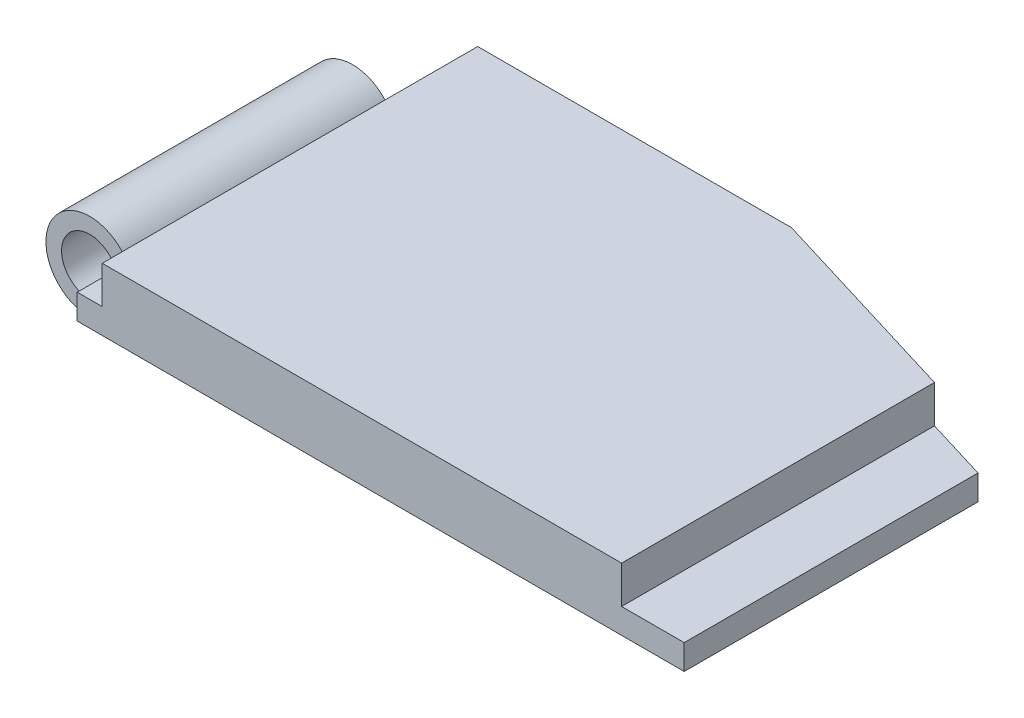
ISO-10303-21;
HEADER;
FILE_DESCRIPTION(('STEP AP214'),'2;1');
FILE_NAME('part.step','',(''),(''),'','','');
FILE_SCHEMA(('AUTOMOTIVE_DESIGN { 1 0 10303 214 1 1 1 1 }'));
ENDSEC;
DATA;
#1=APPLICATION_CONTEXT('core data for automotive mechanical design processes');
#2=APPLICATION_PROTOCOL_DEFINITION('international standard','automotive_design',2000,#1);
#3=PRODUCT_CONTEXT('',#1,'mechanical');
#4=PRODUCT('Part','Part','',(#3));
#5=PRODUCT_RELATED_PRODUCT_CATEGORY('part','',(#4));
#6=PRODUCT_DEFINITION_FORMATION('','',#4);
#7=PRODUCT_DEFINITION_CONTEXT('part definition',#1,'design');
#8=PRODUCT_DEFINITION('design','',#6,#7);
#9=PRODUCT_DEFINITION_SHAPE('','',#8);
#10=(LENGTH_UNIT() NAMED_UNIT(*) SI_UNIT(.MILLI.,.METRE.));
#11=(NAMED_UNIT(*) PLANE_ANGLE_UNIT() SI_UNIT($,.RADIAN.));
#12=(NAMED_UNIT(*) SI_UNIT($,.STERADIAN.) SOLID_ANGLE_UNIT());
#13=UNCERTAINTY_MEASURE_WITH_UNIT(LENGTH_MEASURE(1.E-05),#10,'distance_accuracy_value','');
#14=(GEOMETRIC_REPRESENTATION_CONTEXT(3) GLOBAL_UNCERTAINTY_ASSIGNED_CONTEXT((#13)) GLOBAL_UNIT_ASSIGNED_CONTEXT((#10,
#11,#12)) REPRESENTATION_CONTEXT('',''));
#15=CARTESIAN_POINT('',(0.,0.,0.));
#16=DIRECTION('',(0.,0.,1.));
#17=DIRECTION('',(1.,0.,0.));
#18=AXIS2_PLACEMENT_3D('',#15,#16,#17);
#19=CARTESIAN_POINT('',(0.,-0.25,4.5));
#20=DIRECTION('',(0.,0.,1.));
#21=DIRECTION('',(1.,0.,0.));
#22=AXIS2_PLACEMENT_3D('',#19,#20,#21);
#23=CYLINDRICAL_SURFACE('',#22,3.5);
#24=CARTESIAN_POINT('',(0.,-0.25,4.5));
#25=DIRECTION('',(0.,0.,1.));
#26=DIRECTION('',(1.,0.,0.));
#27=AXIS2_PLACEMENT_3D('',#24,#25,#26);
#28=CIRCLE('',#27,3.5);
#29=CARTESIAN_POINT('',(3.50000000000001,-0.25,4.5));
#30=VERTEX_POINT('',#29);
#31=EDGE_CURVE('E12',#30,#30,#28,.T.);
#32=CARTESIAN_POINT('',(0.,-0.25,25.5));
#33=DIRECTION('',(0.,0.,1.));
#34=DIRECTION('',(1.,0.,0.));
#35=AXIS2_PLACEMENT_3D('',#32,#33,#34);
#36=CIRCLE('',#35,3.5);
#37=CARTESIAN_POINT('',(3.50000000000001,-0.25,25.5));
#38=VERTEX_POINT('',#37);
#39=EDGE_CURVE('E56',#38,#38,#36,.T.);
#40=CARTESIAN_POINT('',(3.50000000000001,-0.25,4.5));
#41=CARTESIAN_POINT('',(3.50000000000001,-0.25,4.71875));
#42=CARTESIAN_POINT('',(3.50000000000001,-0.25,4.9375));
#43=CARTESIAN_POINT('',(3.50000000000001,-0.25,5.375));
#44=CARTESIAN_POINT('',(3.50000000000001,-0.25,5.59375));
#45=CARTESIAN_POINT('',(3.50000000000001,-0.25,6.03125));
#46=CARTESIAN_POINT('',(3.50000000000001,-0.25,6.25));
#47=CARTESIAN_POINT('',(3.50000000000001,-0.25,6.6875));
#48=CARTESIAN_POINT('',(3.50000000000001,-0.25,6.90625));
#49=CARTESIAN_POINT('',(3.50000000000001,-0.25,7.34375));
#50=CARTESIAN_POINT('',(3.50000000000001,-0.25,7.5625));
#51=CARTESIAN_POINT('',(3.50000000000001,-0.25,8.));
#52=CARTESIAN_POINT('',(3.50000000000001,-0.25,8.21875));
#53=CARTESIAN_POINT('',(3.50000000000001,-0.25,8.65625));
#54=CARTESIAN_POINT('',(3.50000000000001,-0.25,8.875));
#55=CARTESIAN_POINT('',(3.50000000000001,-0.25,9.3125));
#56=CARTESIAN_POINT('',(3.50000000000001,-0.25,9.53125));
#57=CARTESIAN_POINT('',(3.50000000000001,-0.25,9.96875));
#58=CARTESIAN_POINT('',(3.50000000000001,-0.25,10.1875));
#59=CARTESIAN_POINT('',(3.50000000000001,-0.25,10.625));
#60=CARTESIAN_POINT('',(3.50000000000001,-0.25,10.84375));
#61=CARTESIAN_POINT('',(3.50000000000001,-0.25,11.28125));
#62=CARTESIAN_POINT('',(3.50000000000001,-0.25,11.5));
#63=CARTESIAN_POINT('',(3.50000000000001,-0.25,11.9375));
#64=CARTESIAN_POINT('',(3.50000000000001,-0.25,12.15625));
#65=CARTESIAN_POINT('',(3.50000000000001,-0.25,12.59375));
#66=CARTESIAN_POINT('',(3.50000000000001,-0.25,12.8125));
#67=CARTESIAN_POINT('',(3.50000000000001,-0.25,13.25));
#68=CARTESIAN_POINT('',(3.50000000000001,-0.25,13.46875));
#69=CARTESIAN_POINT('',(3.50000000000001,-0.25,13.90625));
#70=CARTESIAN_POINT('',(3.50000000000001,-0.25,14.125));
#71=CARTESIAN_POINT('',(3.50000000000001,-0.25,14.5625));
#72=CARTESIAN_POINT('',(3.50000000000001,-0.25,14.78125));
#73=CARTESIAN_POINT('',(3.50000000000001,-0.25,15.21875));
#74=CARTESIAN_POINT('',(3.50000000000001,-0.25,15.4375));
#75=CARTESIAN_POINT('',(3.50000000000001,-0.25,15.875));
#76=CARTESIAN_POINT('',(3.50000000000001,-0.25,16.09375));
#77=CARTESIAN_POINT('',(3.50000000000001,-0.25,16.53125));
#78=CARTESIAN_POINT('',(3.50000000000001,-0.25,16.75));
#79=CARTESIAN_POINT('',(3.50000000000001,-0.25,17.1875));
#80=CARTESIAN_POINT('',(3.50000000000001,-0.25,17.40625));
#81=CARTESIAN_POINT('',(3.50000000000001,-0.25,17.84375));
#82=CARTESIAN_POINT('',(3.50000000000001,-0.25,18.0625));
#83=CARTESIAN_POINT('',(3.50000000000001,-0.25,18.5));
#84=CARTESIAN_POINT('',(3.50000000000001,-0.25,18.71875));
#85=CARTESIAN_POINT('',(3.50000000000001,-0.25,19.15625));
#86=CARTESIAN_POINT('',(3.50000000000001,-0.25,19.375));
#87=CARTESIAN_POINT('',(3.50000000000001,-0.25,19.8125));
#88=CARTESIAN_POINT('',(3.50000000000001,-0.25,20.03125));
#89=CARTESIAN_POINT('',(3.50000000000001,-0.25,20.46875));
#90=CARTESIAN_POINT('',(3.50000000000001,-0.25,20.6875));
#91=CARTESIAN_POINT('',(3.50000000000001,-0.25,21.125));
#92=CARTESIAN_POINT('',(3.50000000000001,-0.25,21.34375));
#93=CARTESIAN_POINT('',(3.50000000000001,-0.25,21.78125));
#94=CARTESIAN_POINT('',(3.50000000000001,-0.25,22.));
#95=CARTESIAN_POINT('',(3.50000000000001,-0.25,22.4375));
#96=CARTESIAN_POINT('',(3.50000000000001,-0.25,22.65625));
#97=CARTESIAN_POINT('',(3.50000000000001,-0.25,23.09375));
#98=CARTESIAN_POINT('',(3.50000000000001,-0.25,23.3125));
#99=CARTESIAN_POINT('',(3.50000000000001,-0.25,23.75));
#100=CARTESIAN_POINT('',(3.50000000000001,-0.25,23.96875));
#101=CARTESIAN_POINT('',(3.50000000000001,-0.25,24.40625));
#102=CARTESIAN_POINT('',(3.50000000000001,-0.25,24.625));
#103=CARTESIAN_POINT('',(3.50000000000001,-0.25,25.0625));
#104=CARTESIAN_POINT('',(3.50000000000001,-0.25,25.28125));
#105=CARTESIAN_POINT('',(3.50000000000001,-0.25,25.5));
#106=B_SPLINE_CURVE_WITH_KNOTS('',3,(#40,#41,#42,#43,#44,#45,#46,#47,#48,#49,#50,#51,#52,#53,
#54,#55,#56,#57,#58,#59,#60,#61,#62,#63,#64,#65,#66,#67,#68,#69,#70,#71,#72,#73,#74,#75,#76,#77,
#78,#79,#80,#81,#82,#83,#84,#85,#86,#87,#88,#89,#90,#91,#92,#93,#94,#95,#96,#97,#98,#99,#100,
#101,#102,#103,#104,#105),.UNSPECIFIED.,.F.,.F.,(4,2,2,2,2,2,2,2,2,2,2,2,2,2,2,2,2,2,2,2,2,2,2,
2,2,2,2,2,2,2,2,2,4),(0.,0.65625,1.3125,1.96875,2.625,3.28125,3.9375,4.59375,5.25,5.90625,
6.5625,7.21875,7.875,8.53125,9.1875,9.84375,10.5,11.15625,11.8125,12.46875,13.125,13.78125,
14.4375,15.09375,15.75,16.40625,17.0625,17.71875,18.375,19.03125,19.6875,20.34375,21.),.UNSPECIFIED.);
#107=EDGE_CURVE('BSEAM47',#30,#38,#106,.T.);
#108=ORIENTED_EDGE('',*,*,#31,.T.);
#109=ORIENTED_EDGE('',*,*,#39,.F.);
#110=ORIENTED_EDGE('',*,*,#107,.T.);
#111=ORIENTED_EDGE('',*,*,#107,.F.);
#112=EDGE_LOOP('',(#108,#110,#109,#111));
#113=FACE_BOUND('',#112,.T.);
#114=ADVANCED_FACE('F47',(#113),#23,.T.);
#115=CARTESIAN_POINT('',(0.,-0.25,4.5));
#116=DIRECTION('',(0.,0.,1.));
#117=DIRECTION('',(1.,0.,0.));
#118=AXIS2_PLACEMENT_3D('',#115,#116,#117);
#119=PLANE('',#118);
#120=ORIENTED_EDGE('',*,*,#31,.F.);
#121=EDGE_LOOP('',(#120));
#122=FACE_BOUND('',#121,.T.);
#123=CARTESIAN_POINT('',(0.,-0.25,4.5));
#124=DIRECTION('',(0.,0.,1.));
#125=DIRECTION('',(1.,0.,0.));
#126=AXIS2_PLACEMENT_3D('',#123,#124,#125);
#127=CIRCLE('',#126,2.25);
#128=CARTESIAN_POINT('',(2.25,-0.25,4.5));
#129=VERTEX_POINT('',#128);
#130=EDGE_CURVE('E54',#129,#129,#127,.T.);
#131=ORIENTED_EDGE('',*,*,#130,.T.);
#132=EDGE_LOOP('',(#131));
#133=FACE_BOUND('',#132,.T.);
#134=ADVANCED_FACE('F76',(#122,#133),#119,.F.);
#135=CARTESIAN_POINT('',(0.,-0.25,4.5));
#136=DIRECTION('',(0.,0.,1.));
#137=DIRECTION('',(1.,0.,0.));
#138=AXIS2_PLACEMENT_3D('',#135,#136,#137);
#139=CYLINDRICAL_SURFACE('',#138,2.25);
#140=CARTESIAN_POINT('',(0.,-0.25,25.5));
#141=DIRECTION('',(0.,0.,1.));
#142=DIRECTION('',(1.,0.,0.));
#143=AXIS2_PLACEMENT_3D('',#140,#141,#142);
#144=CIRCLE('',#143,2.25);
#145=CARTESIAN_POINT('',(2.25,-0.25,25.5));
#146=VERTEX_POINT('',#145);
#147=EDGE_CURVE('E65',#146,#146,#144,.T.);
#148=CARTESIAN_POINT('',(2.25,-0.25,4.5));
#149=CARTESIAN_POINT('',(2.25,-0.25,4.71875));
#150=CARTESIAN_POINT('',(2.25,-0.25,4.9375));
#151=CARTESIAN_POINT('',(2.25,-0.25,5.375));
#152=CARTESIAN_POINT('',(2.25,-0.25,5.59375));
#153=CARTESIAN_POINT('',(2.25,-0.25,6.03125));
#154=CARTESIAN_POINT('',(2.25,-0.25,6.25));
#155=CARTESIAN_POINT('',(2.25,-0.25,6.6875));
#156=CARTESIAN_POINT('',(2.25,-0.25,6.90625));
#157=CARTESIAN_POINT('',(2.25,-0.25,7.34375));
#158=CARTESIAN_POINT('',(2.25,-0.25,7.5625));
#159=CARTESIAN_POINT('',(2.25,-0.25,8.));
#160=CARTESIAN_POINT('',(2.25,-0.25,8.21875));
#161=CARTESIAN_POINT('',(2.25,-0.25,8.65625));
#162=CARTESIAN_POINT('',(2.25,-0.25,8.875));
#163=CARTESIAN_POINT('',(2.25,-0.25,9.3125));
#164=CARTESIAN_POINT('',(2.25,-0.25,9.53125));
#165=CARTESIAN_POINT('',(2.25,-0.25,9.96875));
#166=CARTESIAN_POINT('',(2.25,-0.25,10.1875));
#167=CARTESIAN_POINT('',(2.25,-0.25,10.625));
#168=CARTESIAN_POINT('',(2.25,-0.25,10.84375));
#169=CARTESIAN_POINT('',(2.25,-0.25,11.28125));
#170=CARTESIAN_POINT('',(2.25,-0.25,11.5));
#171=CARTESIAN_POINT('',(2.25,-0.25,11.9375));
#172=CARTESIAN_POINT('',(2.25,-0.25,12.15625));
#173=CARTESIAN_POINT('',(2.25,-0.25,12.59375));
#174=CARTESIAN_POINT('',(2.25,-0.25,12.8125));
#175=CARTESIAN_POINT('',(2.25,-0.25,13.25));
#176=CARTESIAN_POINT('',(2.25,-0.25,13.46875));
#177=CARTESIAN_POINT('',(2.25,-0.25,13.90625));
#178=CARTESIAN_POINT('',(2.25,-0.25,14.125));
#179=CARTESIAN_POINT('',(2.25,-0.25,14.5625));
#180=CARTESIAN_POINT('',(2.25,-0.25,14.78125));
#181=CARTESIAN_POINT('',(2.25,-0.25,15.21875));
#182=CARTESIAN_POINT('',(2.25,-0.25,15.4375));
#183=CARTESIAN_POINT('',(2.25,-0.25,15.875));
#184=CARTESIAN_POINT('',(2.25,-0.25,16.09375));
#185=CARTESIAN_POINT('',(2.25,-0.25,16.53125));
#186=CARTESIAN_POINT('',(2.25,-0.25,16.75));
#187=CARTESIAN_POINT('',(2.25,-0.25,17.1875));
#188=CARTESIAN_POINT('',(2.25,-0.25,17.40625));
#189=CARTESIAN_POINT('',(2.25,-0.25,17.84375));
#190=CARTESIAN_POINT('',(2.25,-0.25,18.0625));
#191=CARTESIAN_POINT('',(2.25,-0.25,18.5));
#192=CARTESIAN_POINT('',(2.25,-0.25,18.71875));
#193=CARTESIAN_POINT('',(2.25,-0.25,19.15625));
#194=CARTESIAN_POINT('',(2.25,-0.25,19.375));
#195=CARTESIAN_POINT('',(2.25,-0.25,19.8125));
#196=CARTESIAN_POINT('',(2.25,-0.25,20.03125));
#197=CARTESIAN_POINT('',(2.25,-0.25,20.46875));
#198=CARTESIAN_POINT('',(2.25,-0.25,20.6875));
#199=CARTESIAN_POINT('',(2.25,-0.25,21.125));
#200=CARTESIAN_POINT('',(2.25,-0.25,21.34375));
#201=CARTESIAN_POINT('',(2.25,-0.25,21.78125));
#202=CARTESIAN_POINT('',(2.25,-0.25,22.));
#203=CARTESIAN_POINT('',(2.25,-0.25,22.4375));
#204=CARTESIAN_POINT('',(2.25,-0.25,22.65625));
#205=CARTESIAN_POINT('',(2.25,-0.25,23.09375));
#206=CARTESIAN_POINT('',(2.25,-0.25,23.3125));
#207=CARTESIAN_POINT('',(2.25,-0.25,23.75));
#208=CARTESIAN_POINT('',(2.25,-0.25,23.96875));
#209=CARTESIAN_POINT('',(2.25,-0.25,24.40625));
#210=CARTESIAN_POINT('',(2.25,-0.25,24.625));
#211=CARTESIAN_POINT('',(2.25,-0.25,25.0625));
#212=CARTESIAN_POINT('',(2.25,-0.25,25.28125));
#213=CARTESIAN_POINT('',(2.25,-0.25,25.5));
#214=B_SPLINE_CURVE_WITH_KNOTS('',3,(#148,#149,#150,#151,#152,#153,#154,#155,#156,#157,#158,
#159,#160,#161,#162,#163,#164,#165,#166,#167,#168,#169,#170,#171,#172,#173,#174,#175,#176,#177,
#178,#179,#180,#181,#182,#183,#184,#185,#186,#187,#188,#189,#190,#191,#192,#193,#194,#195,#196,
#197,#198,#199,#200,#201,#202,#203,#204,#205,#206,#207,#208,#209,#210,#211,#212,#213),
.UNSPECIFIED.,.F.,.F.,(4,2,2,2,2,2,2,2,2,2,2,2,2,2,2,2,2,2,2,2,2,2,2,2,2,2,2,2,2,2,2,2,4),(0.,
0.65625,1.3125,1.96875,2.625,3.28125,3.9375,4.59375,5.25,5.90625,6.5625,7.21875,7.875,8.53125,
9.1875,9.84375,10.5,11.15625,11.8125,12.46875,13.125,13.78125,14.4375,15.09375,15.75,16.40625,
17.0625,17.71875,18.375,19.03125,19.6875,20.34375,21.),.UNSPECIFIED.);
#215=EDGE_CURVE('BSEAM67',#129,#146,#214,.T.);
#216=ORIENTED_EDGE('',*,*,#130,.F.);
#217=ORIENTED_EDGE('',*,*,#147,.T.);
#218=ORIENTED_EDGE('',*,*,#215,.T.);
#219=ORIENTED_EDGE('',*,*,#215,.F.);
#220=EDGE_LOOP('',(#216,#218,#217,#219));
#221=FACE_BOUND('',#220,.T.);
#222=ADVANCED_FACE('F67',(#221),#139,.F.);
#223=CARTESIAN_POINT('',(0.,-0.25,25.5));
#224=DIRECTION('',(0.,0.,1.));
#225=DIRECTION('',(1.,0.,0.));
#226=AXIS2_PLACEMENT_3D('',#223,#224,#225);
#227=PLANE('',#226);
#228=ORIENTED_EDGE('',*,*,#147,.F.);
#229=EDGE_LOOP('',(#228));
#230=FACE_BOUND('',#229,.T.);
#231=ORIENTED_EDGE('',*,*,#39,.T.);
#232=EDGE_LOOP('',(#231));
#233=FACE_BOUND('',#232,.T.);
#234=ADVANCED_FACE('F72',(#230,#233),#227,.T.);
#235=CLOSED_SHELL('',(#114,#134,#222,#234));
#236=MANIFOLD_SOLID_BREP('B2',#235);
#237=CARTESIAN_POINT('',(52.,2.,0.));
#238=DIRECTION('',(-1.,0.,0.));
#239=DIRECTION('',(0.,0.,1.));
#240=AXIS2_PLACEMENT_3D('',#237,#238,#239);
#241=PLANE('',#240);
#242=DIRECTION('',(0.,-1.,0.));
#243=VECTOR('',#242,1.);
#244=CARTESIAN_POINT('',(52.,5.,6.52360130335339));
#245=LINE('',#244,#243);
#246=CARTESIAN_POINT('',(52.,2.,6.52360130335339));
#247=VERTEX_POINT('',#246);
#248=CARTESIAN_POINT('',(52.,0.,6.52360130335339));
#249=VERTEX_POINT('',#248);
#250=EDGE_CURVE('E227',#247,#249,#245,.T.);
#251=ORIENTED_EDGE('',*,*,#250,.F.);
#252=DIRECTION('',(0.,0.,-1.));
#253=VECTOR('',#252,1.);
#254=CARTESIAN_POINT('',(52.,2.,0.));
#255=LINE('',#254,#253);
#256=CARTESIAN_POINT('',(52.,2.,30.));
#257=VERTEX_POINT('',#256);
#258=EDGE_CURVE('E340',#257,#247,#255,.T.);
#259=ORIENTED_EDGE('',*,*,#258,.F.);
#260=DIRECTION('',(0.,-1.,0.));
#261=VECTOR('',#260,1.);
#262=CARTESIAN_POINT('',(52.,2.,30.));
#263=LINE('',#262,#261);
#264=CARTESIAN_POINT('',(52.,0.,30.));
#265=VERTEX_POINT('',#264);
#266=EDGE_CURVE('E341',#257,#265,#263,.T.);
#267=ORIENTED_EDGE('',*,*,#266,.T.);
#268=DIRECTION('',(0.,0.,-1.));
#269=VECTOR('',#268,1.);
#270=CARTESIAN_POINT('',(52.,0.,0.));
#271=LINE('',#270,#269);
#272=EDGE_CURVE('E343',#265,#249,#271,.T.);
#273=ORIENTED_EDGE('',*,*,#272,.T.);
#274=EDGE_LOOP('',(#251,#259,#267,#273));
#275=FACE_BOUND('',#274,.T.);
#276=ADVANCED_FACE('F101',(#275),#241,.F.);
#277=CARTESIAN_POINT('',(0.,0.,0.));
#278=DIRECTION('',(0.,1.,0.));
#279=DIRECTION('',(0.,0.,1.));
#280=AXIS2_PLACEMENT_3D('',#277,#278,#279);
#281=PLANE('',#280);
#282=DIRECTION('',(0.,0.,-1.));
#283=VECTOR('',#282,1.);
#284=CARTESIAN_POINT('',(23.,0.,17.6));
#285=LINE('',#284,#283);
#286=CARTESIAN_POINT('',(23.,0.,17.6));
#287=VERTEX_POINT('',#286);
#288=CARTESIAN_POINT('',(23.,0.,14.6));
#289=VERTEX_POINT('',#288);
#290=EDGE_CURVE('E298',#287,#289,#285,.T.);
#291=ORIENTED_EDGE('',*,*,#290,.F.);
#292=DIRECTION('',(-1.,0.,0.));
#293=VECTOR('',#292,1.);
#294=CARTESIAN_POINT('',(23.,0.,17.6));
#295=LINE('',#294,#293);
#296=CARTESIAN_POINT('',(29.,0.,17.6));
#297=VERTEX_POINT('',#296);
#298=EDGE_CURVE('E301',#297,#287,#295,.T.);
#299=ORIENTED_EDGE('',*,*,#298,.F.);
#300=DIRECTION('',(0.,0.,1.));
#301=VECTOR('',#300,1.);
#302=CARTESIAN_POINT('',(29.,0.,17.6));
#303=LINE('',#302,#301);
#304=CARTESIAN_POINT('',(29.,0.,14.6));
#305=VERTEX_POINT('',#304);
#306=EDGE_CURVE('E312',#305,#297,#303,.T.);
#307=ORIENTED_EDGE('',*,*,#306,.F.);
#308=DIRECTION('',(1.,0.,0.));
#309=VECTOR('',#308,1.);
#310=CARTESIAN_POINT('',(23.,0.,14.6));
#311=LINE('',#310,#309);
#312=EDGE_CURVE('E309',#289,#305,#311,.T.);
#313=ORIENTED_EDGE('',*,*,#312,.F.);
#314=EDGE_LOOP('',(#291,#299,#307,#313));
#315=FACE_BOUND('',#314,.T.);
#316=DIRECTION('',(-0.956603378501506,0.,-0.291393164366468));
#317=VECTOR('',#316,1.);
#318=CARTESIAN_POINT('',(30.5839209359888,0.,0.));
#319=LINE('',#318,#317);
#320=CARTESIAN_POINT('',(30.5839209359888,0.,0.));
#321=VERTEX_POINT('',#320);
#322=EDGE_CURVE('E225',#249,#321,#319,.T.);
#323=ORIENTED_EDGE('',*,*,#322,.F.);
#324=ORIENTED_EDGE('',*,*,#272,.F.);
#325=DIRECTION('',(1.,0.,0.));
#326=VECTOR('',#325,1.);
#327=CARTESIAN_POINT('',(0.,0.,30.));
#328=LINE('',#327,#326);
#329=CARTESIAN_POINT('',(3.5,0.,30.));
#330=VERTEX_POINT('',#329);
#331=EDGE_CURVE('E327',#330,#265,#328,.T.);
#332=ORIENTED_EDGE('',*,*,#331,.F.);
#333=DIRECTION('',(0.,0.,-1.));
#334=VECTOR('',#333,1.);
#335=CARTESIAN_POINT('',(3.5,0.,0.));
#336=LINE('',#335,#334);
#337=CARTESIAN_POINT('',(3.5,0.,25.5));
#338=VERTEX_POINT('',#337);
#339=EDGE_CURVE('E111',#330,#338,#336,.T.);
#340=ORIENTED_EDGE('',*,*,#339,.T.);
#341=DIRECTION('',(-1.,0.,0.));
#342=VECTOR('',#341,1.);
#343=CARTESIAN_POINT('',(0.,0.,25.5));
#344=LINE('',#343,#342);
#345=CARTESIAN_POINT('',(2.2360679774998,0.,25.5));
#346=VERTEX_POINT('',#345);
#347=EDGE_CURVE('E280',#338,#346,#344,.T.);
#348=ORIENTED_EDGE('',*,*,#347,.T.);
#349=DIRECTION('',(0.,0.,1.));
#350=VECTOR('',#349,1.);
#351=CARTESIAN_POINT('',(2.2360679774998,0.,0.));
#352=LINE('',#351,#350);
#353=CARTESIAN_POINT('',(2.2360679774998,0.,4.5));
#354=VERTEX_POINT('',#353);
#355=EDGE_CURVE('E290',#346,#354,#352,.F.);
#356=ORIENTED_EDGE('',*,*,#355,.T.);
#357=DIRECTION('',(1.,0.,0.));
#358=VECTOR('',#357,1.);
#359=CARTESIAN_POINT('',(0.,0.,4.5));
#360=LINE('',#359,#358);
#361=CARTESIAN_POINT('',(3.5,0.,4.5));
#362=VERTEX_POINT('',#361);
#363=EDGE_CURVE('E269',#354,#362,#360,.T.);
#364=ORIENTED_EDGE('',*,*,#363,.T.);
#365=DIRECTION('',(0.,0.,-1.));
#366=VECTOR('',#365,1.);
#367=CARTESIAN_POINT('',(3.5,0.,0.));
#368=LINE('',#367,#366);
#369=CARTESIAN_POINT('',(3.5,0.,0.));
#370=VERTEX_POINT('',#369);
#371=EDGE_CURVE('E283',#362,#370,#368,.T.);
#372=ORIENTED_EDGE('',*,*,#371,.T.);
#373=DIRECTION('',(-1.,0.,0.));
#374=VECTOR('',#373,1.);
#375=CARTESIAN_POINT('',(0.,0.,0.));
#376=LINE('',#375,#374);
#377=EDGE_CURVE('E334',#321,#370,#376,.T.);
#378=ORIENTED_EDGE('',*,*,#377,.F.);
#379=EDGE_LOOP('',(#323,#324,#332,#340,#348,#356,#364,#372,#378));
#380=FACE_BOUND('',#379,.T.);
#381=ADVANCED_FACE('F363',(#315,#380),#281,.F.);
#382=CARTESIAN_POINT('',(0.,2.,0.));
#383=DIRECTION('',(0.,1.,0.));
#384=DIRECTION('',(0.,0.,1.));
#385=AXIS2_PLACEMENT_3D('',#382,#383,#384);
#386=PLANE('',#385);
#387=DIRECTION('',(0.956603378501507,0.,0.291393164366468));
#388=VECTOR('',#387,1.);
#389=CARTESIAN_POINT('',(2.59687999998566,2.,-8.52519717458116));
#390=LINE('',#389,#388);
#391=CARTESIAN_POINT('',(47.,2.,5.00053975603308));
#392=VERTEX_POINT('',#391);
#393=EDGE_CURVE('E228',#392,#247,#390,.T.);
#394=ORIENTED_EDGE('',*,*,#393,.F.);
#395=DIRECTION('',(0.,0.,-1.));
#396=VECTOR('',#395,1.);
#397=CARTESIAN_POINT('',(47.,2.,0.));
#398=LINE('',#397,#396);
#399=CARTESIAN_POINT('',(47.,2.,30.));
#400=VERTEX_POINT('',#399);
#401=EDGE_CURVE('E249',#400,#392,#398,.T.);
#402=ORIENTED_EDGE('',*,*,#401,.F.);
#403=DIRECTION('',(1.,0.,0.));
#404=VECTOR('',#403,1.);
#405=CARTESIAN_POINT('',(0.,2.,30.));
#406=LINE('',#405,#404);
#407=EDGE_CURVE('E333',#400,#257,#406,.T.);
#408=ORIENTED_EDGE('',*,*,#407,.T.);
#409=ORIENTED_EDGE('',*,*,#258,.T.);
#410=EDGE_LOOP('',(#394,#402,#408,#409));
#411=FACE_BOUND('',#410,.T.);
#412=ADVANCED_FACE('F381',(#411),#386,.T.);
#413=CARTESIAN_POINT('',(0.,2.,30.));
#414=DIRECTION('',(0.,0.,-1.));
#415=DIRECTION('',(-1.,0.,0.));
#416=AXIS2_PLACEMENT_3D('',#413,#414,#415);
#417=PLANE('',#416);
#418=CARTESIAN_POINT('',(3.5,2.,30.));
#419=VERTEX_POINT('',#418);
#420=CARTESIAN_POINT('',(5.50000000000001,2.,30.));
#421=VERTEX_POINT('',#420);
#422=EDGE_CURVE('E331',#419,#421,#406,.T.);
#423=ORIENTED_EDGE('',*,*,#422,.F.);
#424=DIRECTION('',(0.,-1.,0.));
#425=VECTOR('',#424,1.);
#426=CARTESIAN_POINT('',(3.5,2.,30.));
#427=LINE('',#426,#425);
#428=EDGE_CURVE('E282',#419,#330,#427,.T.);
#429=ORIENTED_EDGE('',*,*,#428,.T.);
#430=ORIENTED_EDGE('',*,*,#331,.T.);
#431=ORIENTED_EDGE('',*,*,#266,.F.);
#432=ORIENTED_EDGE('',*,*,#407,.F.);
#433=DIRECTION('',(0.,-1.,0.));
#434=VECTOR('',#433,1.);
#435=CARTESIAN_POINT('',(47.,5.,30.));
#436=LINE('',#435,#434);
#437=CARTESIAN_POINT('',(47.,5.,30.));
#438=VERTEX_POINT('',#437);
#439=EDGE_CURVE('E248',#438,#400,#436,.T.);
#440=ORIENTED_EDGE('',*,*,#439,.F.);
#441=DIRECTION('',(1.,0.,0.));
#442=VECTOR('',#441,1.);
#443=CARTESIAN_POINT('',(47.,5.,30.));
#444=LINE('',#443,#442);
#445=CARTESIAN_POINT('',(5.50000000000001,5.,30.));
#446=VERTEX_POINT('',#445);
#447=EDGE_CURVE('E243',#446,#438,#444,.T.);
#448=ORIENTED_EDGE('',*,*,#447,.F.);
#449=DIRECTION('',(0.,-1.,0.));
#450=VECTOR('',#449,1.);
#451=CARTESIAN_POINT('',(5.50000000000001,5.,30.));
#452=LINE('',#451,#450);
#453=EDGE_CURVE('E259',#446,#421,#452,.T.);
#454=ORIENTED_EDGE('',*,*,#453,.T.);
#455=EDGE_LOOP('',(#423,#429,#430,#431,#432,#440,#448,#454));
#456=FACE_BOUND('',#455,.T.);
#457=ADVANCED_FACE('F102',(#456),#417,.F.);
#458=CARTESIAN_POINT('',(0.,2.,0.));
#459=DIRECTION('',(0.,0.,1.));
#460=DIRECTION('',(1.,0.,0.));
#461=AXIS2_PLACEMENT_3D('',#458,#459,#460);
#462=PLANE('',#461);
#463=DIRECTION('',(-1.,0.,0.));
#464=VECTOR('',#463,1.);
#465=CARTESIAN_POINT('',(47.,5.,0.));
#466=LINE('',#465,#464);
#467=CARTESIAN_POINT('',(30.5839209359888,5.,0.));
#468=VERTEX_POINT('',#467);
#469=CARTESIAN_POINT('',(5.50000000000001,5.,0.));
#470=VERTEX_POINT('',#469);
#471=EDGE_CURVE('E235',#468,#470,#466,.T.);
#472=ORIENTED_EDGE('',*,*,#471,.F.);
#473=DIRECTION('',(0.,-1.,0.));
#474=VECTOR('',#473,1.);
#475=CARTESIAN_POINT('',(30.5839209359888,5.,0.));
#476=LINE('',#475,#474);
#477=EDGE_CURVE('E217',#468,#321,#476,.T.);
#478=ORIENTED_EDGE('',*,*,#477,.T.);
#479=ORIENTED_EDGE('',*,*,#377,.T.);
#480=DIRECTION('',(0.,1.,0.));
#481=VECTOR('',#480,1.);
#482=CARTESIAN_POINT('',(3.5,2.,0.));
#483=LINE('',#482,#481);
#484=CARTESIAN_POINT('',(3.5,2.,0.));
#485=VERTEX_POINT('',#484);
#486=EDGE_CURVE('E358',#370,#485,#483,.T.);
#487=ORIENTED_EDGE('',*,*,#486,.T.);
#488=DIRECTION('',(-1.,0.,0.));
#489=VECTOR('',#488,1.);
#490=CARTESIAN_POINT('',(0.,2.,0.));
#491=LINE('',#490,#489);
#492=CARTESIAN_POINT('',(5.50000000000001,2.,0.));
#493=VERTEX_POINT('',#492);
#494=EDGE_CURVE('E338',#493,#485,#491,.T.);
#495=ORIENTED_EDGE('',*,*,#494,.F.);
#496=DIRECTION('',(0.,-1.,0.));
#497=VECTOR('',#496,1.);
#498=CARTESIAN_POINT('',(5.50000000000001,5.,0.));
#499=LINE('',#498,#497);
#500=EDGE_CURVE('E237',#470,#493,#499,.T.);
#501=ORIENTED_EDGE('',*,*,#500,.F.);
#502=EDGE_LOOP('',(#472,#478,#479,#487,#495,#501));
#503=FACE_BOUND('',#502,.T.);
#504=ADVANCED_FACE('F240',(#503),#462,.F.);
#505=DIRECTION('',(0.,0.,1.));
#506=VECTOR('',#505,1.);
#507=CARTESIAN_POINT('',(5.50000000000001,2.,0.));
#508=LINE('',#507,#506);
#509=EDGE_CURVE('E123',#493,#421,#508,.T.);
#510=ORIENTED_EDGE('',*,*,#509,.F.);
#511=ORIENTED_EDGE('',*,*,#494,.T.);
#512=DIRECTION('',(0.,0.,-1.));
#513=VECTOR('',#512,1.);
#514=CARTESIAN_POINT('',(3.5,2.,4.5));
#515=LINE('',#514,#513);
#516=CARTESIAN_POINT('',(3.5,2.,4.5));
#517=VERTEX_POINT('',#516);
#518=EDGE_CURVE('E272',#517,#485,#515,.T.);
#519=ORIENTED_EDGE('',*,*,#518,.F.);
#520=DIRECTION('',(1.,0.,0.));
#521=VECTOR('',#520,1.);
#522=CARTESIAN_POINT('',(0.,2.,4.5));
#523=LINE('',#522,#521);
#524=CARTESIAN_POINT('',(0.,2.,4.5));
#525=VERTEX_POINT('',#524);
#526=EDGE_CURVE('E264',#525,#517,#523,.T.);
#527=ORIENTED_EDGE('',*,*,#526,.F.);
#528=DIRECTION('',(0.,0.,1.));
#529=VECTOR('',#528,1.);
#530=CARTESIAN_POINT('',(0.,2.,0.));
#531=LINE('',#530,#529);
#532=CARTESIAN_POINT('',(0.,2.,25.5));
#533=VERTEX_POINT('',#532);
#534=EDGE_CURVE('E329',#525,#533,#531,.T.);
#535=ORIENTED_EDGE('',*,*,#534,.T.);
#536=DIRECTION('',(-1.,0.,0.));
#537=VECTOR('',#536,1.);
#538=CARTESIAN_POINT('',(-1.269814724213,2.,25.5));
#539=LINE('',#538,#537);
#540=CARTESIAN_POINT('',(3.5,2.,25.5));
#541=VERTEX_POINT('',#540);
#542=EDGE_CURVE('E262',#541,#533,#539,.T.);
#543=ORIENTED_EDGE('',*,*,#542,.F.);
#544=DIRECTION('',(0.,0.,-1.));
#545=VECTOR('',#544,1.);
#546=CARTESIAN_POINT('',(3.5,2.,25.5));
#547=LINE('',#546,#545);
#548=EDGE_CURVE('E263',#419,#541,#547,.T.);
#549=ORIENTED_EDGE('',*,*,#548,.F.);
#550=ORIENTED_EDGE('',*,*,#422,.T.);
#551=EDGE_LOOP('',(#510,#511,#519,#527,#535,#543,#549,#550));
#552=FACE_BOUND('',#551,.T.);
#553=ADVANCED_FACE('F373',(#552),#386,.T.);
#554=CARTESIAN_POINT('',(23.,-7.,17.6));
#555=DIRECTION('',(1.,0.,0.));
#556=DIRECTION('',(0.,0.,-1.));
#557=AXIS2_PLACEMENT_3D('',#554,#555,#556);
#558=PLANE('',#557);
#559=ORIENTED_EDGE('',*,*,#290,.T.);
#560=DIRECTION('',(0.,1.,0.));
#561=VECTOR('',#560,1.);
#562=CARTESIAN_POINT('',(23.,-7.,14.6));
#563=LINE('',#562,#561);
#564=CARTESIAN_POINT('',(23.,-7.,14.6));
#565=VERTEX_POINT('',#564);
#566=EDGE_CURVE('E328',#565,#289,#563,.T.);
#567=ORIENTED_EDGE('',*,*,#566,.F.);
#568=DIRECTION('',(0.,0.,-1.));
#569=VECTOR('',#568,1.);
#570=CARTESIAN_POINT('',(23.,-7.,17.6));
#571=LINE('',#570,#569);
#572=CARTESIAN_POINT('',(23.,-7.,17.6));
#573=VERTEX_POINT('',#572);
#574=EDGE_CURVE('E300',#573,#565,#571,.T.);
#575=ORIENTED_EDGE('',*,*,#574,.F.);
#576=DIRECTION('',(0.,1.,0.));
#577=VECTOR('',#576,1.);
#578=CARTESIAN_POINT('',(23.,-7.,17.6));
#579=LINE('',#578,#577);
#580=EDGE_CURVE('E310',#573,#287,#579,.T.);
#581=ORIENTED_EDGE('',*,*,#580,.T.);
#582=EDGE_LOOP('',(#559,#567,#575,#581));
#583=FACE_BOUND('',#582,.T.);
#584=ADVANCED_FACE('F402',(#583),#558,.F.);
#585=CARTESIAN_POINT('',(23.,-7.,14.6));
#586=DIRECTION('',(0.,0.,1.));
#587=DIRECTION('',(1.,0.,0.));
#588=AXIS2_PLACEMENT_3D('',#585,#586,#587);
#589=PLANE('',#588);
#590=CARTESIAN_POINT('',(26.,-4.,14.6));
#591=DIRECTION('',(0.,0.,1.));
#592=DIRECTION('',(1.,0.,0.));
#593=AXIS2_PLACEMENT_3D('',#590,#591,#592);
#594=CIRCLE('',#593,1.);
#595=CARTESIAN_POINT('',(27.,-4.,14.6));
#596=VERTEX_POINT('',#595);
#597=EDGE_CURVE('E291',#596,#596,#594,.T.);
#598=ORIENTED_EDGE('',*,*,#597,.T.);
#599=EDGE_LOOP('',(#598));
#600=FACE_BOUND('',#599,.T.);
#601=ORIENTED_EDGE('',*,*,#312,.T.);
#602=DIRECTION('',(0.,1.,0.));
#603=VECTOR('',#602,1.);
#604=CARTESIAN_POINT('',(29.,-7.,14.6));
#605=LINE('',#604,#603);
#606=CARTESIAN_POINT('',(29.,-7.,14.6));
#607=VERTEX_POINT('',#606);
#608=EDGE_CURVE('E325',#607,#305,#605,.T.);
#609=ORIENTED_EDGE('',*,*,#608,.F.);
#610=DIRECTION('',(1.,0.,0.));
#611=VECTOR('',#610,1.);
#612=CARTESIAN_POINT('',(23.,-7.,14.6));
#613=LINE('',#612,#611);
#614=EDGE_CURVE('E297',#565,#607,#613,.T.);
#615=ORIENTED_EDGE('',*,*,#614,.F.);
#616=ORIENTED_EDGE('',*,*,#566,.T.);
#617=EDGE_LOOP('',(#601,#609,#615,#616));
#618=FACE_BOUND('',#617,.T.);
#619=ADVANCED_FACE('F404',(#600,#618),#589,.F.);
#620=CARTESIAN_POINT('',(29.,-7.,17.6));
#621=DIRECTION('',(-1.,0.,0.));
#622=DIRECTION('',(0.,0.,1.));
#623=AXIS2_PLACEMENT_3D('',#620,#621,#622);
#624=PLANE('',#623);
#625=ORIENTED_EDGE('',*,*,#306,.T.);
#626=DIRECTION('',(0.,1.,0.));
#627=VECTOR('',#626,1.);
#628=CARTESIAN_POINT('',(29.,-7.,17.6));
#629=LINE('',#628,#627);
#630=CARTESIAN_POINT('',(29.,-7.,17.6));
#631=VERTEX_POINT('',#630);
#632=EDGE_CURVE('E318',#631,#297,#629,.T.);
#633=ORIENTED_EDGE('',*,*,#632,.F.);
#634=DIRECTION('',(0.,0.,1.));
#635=VECTOR('',#634,1.);
#636=CARTESIAN_POINT('',(29.,-7.,17.6));
#637=LINE('',#636,#635);
#638=EDGE_CURVE('E303',#607,#631,#637,.T.);
#639=ORIENTED_EDGE('',*,*,#638,.F.);
#640=ORIENTED_EDGE('',*,*,#608,.T.);
#641=EDGE_LOOP('',(#625,#633,#639,#640));
#642=FACE_BOUND('',#641,.T.);
#643=ADVANCED_FACE('F410',(#642),#624,.F.);
#644=CARTESIAN_POINT('',(23.,-7.,17.6));
#645=DIRECTION('',(0.,0.,-1.));
#646=DIRECTION('',(-1.,0.,0.));
#647=AXIS2_PLACEMENT_3D('',#644,#645,#646);
#648=PLANE('',#647);
#649=CARTESIAN_POINT('',(26.,-4.,17.6));
#650=DIRECTION('',(0.,0.,1.));
#651=DIRECTION('',(1.,0.,0.));
#652=AXIS2_PLACEMENT_3D('',#649,#650,#651);
#653=CIRCLE('',#652,1.);
#654=CARTESIAN_POINT('',(27.,-4.,17.6));
#655=VERTEX_POINT('',#654);
#656=EDGE_CURVE('E286',#655,#655,#653,.T.);
#657=ORIENTED_EDGE('',*,*,#656,.F.);
#658=EDGE_LOOP('',(#657));
#659=FACE_BOUND('',#658,.T.);
#660=ORIENTED_EDGE('',*,*,#298,.T.);
#661=ORIENTED_EDGE('',*,*,#580,.F.);
#662=DIRECTION('',(-1.,0.,0.));
#663=VECTOR('',#662,1.);
#664=CARTESIAN_POINT('',(23.,-7.,17.6));
#665=LINE('',#664,#663);
#666=EDGE_CURVE('E304',#631,#573,#665,.T.);
#667=ORIENTED_EDGE('',*,*,#666,.F.);
#668=ORIENTED_EDGE('',*,*,#632,.T.);
#669=EDGE_LOOP('',(#660,#661,#667,#668));
#670=FACE_BOUND('',#669,.T.);
#671=ADVANCED_FACE('F415',(#659,#670),#648,.F.);
#672=CARTESIAN_POINT('',(0.,-7.,0.));
#673=DIRECTION('',(0.,-1.,0.));
#674=DIRECTION('',(0.,0.,-1.));
#675=AXIS2_PLACEMENT_3D('',#672,#673,#674);
#676=PLANE('',#675);
#677=ORIENTED_EDGE('',*,*,#574,.T.);
#678=ORIENTED_EDGE('',*,*,#614,.T.);
#679=ORIENTED_EDGE('',*,*,#638,.T.);
#680=ORIENTED_EDGE('',*,*,#666,.T.);
#681=EDGE_LOOP('',(#677,#678,#679,#680));
#682=FACE_BOUND('',#681,.T.);
#683=ADVANCED_FACE('F417',(#682),#676,.T.);
#684=CARTESIAN_POINT('',(26.,-4.,0.));
#685=DIRECTION('',(0.,0.,1.));
#686=DIRECTION('',(1.,0.,0.));
#687=AXIS2_PLACEMENT_3D('',#684,#685,#686);
#688=CYLINDRICAL_SURFACE('',#687,1.);
#689=ORIENTED_EDGE('',*,*,#656,.T.);
#690=EDGE_LOOP('',(#689));
#691=FACE_BOUND('',#690,.T.);
#692=ORIENTED_EDGE('',*,*,#597,.F.);
#693=EDGE_LOOP('',(#692));
#694=FACE_BOUND('',#693,.T.);
#695=ADVANCED_FACE('F416',(#691,#694),#688,.F.);
#696=CARTESIAN_POINT('',(0.,-0.25,0.));
#697=DIRECTION('',(0.,0.,1.));
#698=DIRECTION('',(1.,0.,0.));
#699=AXIS2_PLACEMENT_3D('',#696,#697,#698);
#700=CYLINDRICAL_SURFACE('',#699,2.25);
#701=ORIENTED_EDGE('',*,*,#355,.F.);
#702=CARTESIAN_POINT('',(0.,-0.25,25.5));
#703=DIRECTION('',(0.,0.,-1.));
#704=DIRECTION('',(-1.,0.,0.));
#705=AXIS2_PLACEMENT_3D('',#702,#703,#704);
#706=CIRCLE('',#705,2.25);
#707=EDGE_CURVE('E353',#346,#533,#706,.F.);
#708=ORIENTED_EDGE('',*,*,#707,.T.);
#709=ORIENTED_EDGE('',*,*,#534,.F.);
#710=CARTESIAN_POINT('',(0.,-0.25,4.5));
#711=DIRECTION('',(0.,0.,1.));
#712=DIRECTION('',(1.,0.,0.));
#713=AXIS2_PLACEMENT_3D('',#710,#711,#712);
#714=CIRCLE('',#713,2.25);
#715=EDGE_CURVE('E349',#525,#354,#714,.F.);
#716=ORIENTED_EDGE('',*,*,#715,.T.);
#717=EDGE_LOOP('',(#701,#708,#709,#716));
#718=FACE_BOUND('',#717,.T.);
#719=ADVANCED_FACE('F425',(#718),#700,.F.);
#720=CARTESIAN_POINT('',(3.5,-7.,4.5));
#721=DIRECTION('',(1.,0.,0.));
#722=DIRECTION('',(0.,0.,-1.));
#723=AXIS2_PLACEMENT_3D('',#720,#721,#722);
#724=PLANE('',#723);
#725=DIRECTION('',(0.,1.,0.));
#726=VECTOR('',#725,1.);
#727=CARTESIAN_POINT('',(3.5,-7.,4.5));
#728=LINE('',#727,#726);
#729=EDGE_CURVE('E257',#362,#517,#728,.T.);
#730=ORIENTED_EDGE('',*,*,#729,.T.);
#731=ORIENTED_EDGE('',*,*,#518,.T.);
#732=ORIENTED_EDGE('',*,*,#486,.F.);
#733=ORIENTED_EDGE('',*,*,#371,.F.);
#734=EDGE_LOOP('',(#730,#731,#732,#733));
#735=FACE_BOUND('',#734,.T.);
#736=ADVANCED_FACE('F426',(#735),#724,.F.);
#737=CARTESIAN_POINT('',(0.,-7.,4.5));
#738=DIRECTION('',(0.,0.,1.));
#739=DIRECTION('',(1.,0.,0.));
#740=AXIS2_PLACEMENT_3D('',#737,#738,#739);
#741=PLANE('',#740);
#742=ORIENTED_EDGE('',*,*,#715,.F.);
#743=ORIENTED_EDGE('',*,*,#526,.T.);
#744=ORIENTED_EDGE('',*,*,#729,.F.);
#745=ORIENTED_EDGE('',*,*,#363,.F.);
#746=EDGE_LOOP('',(#742,#743,#744,#745));
#747=FACE_BOUND('',#746,.T.);
#748=ADVANCED_FACE('F435',(#747),#741,.F.);
#749=CARTESIAN_POINT('',(3.5,-7.,25.5));
#750=DIRECTION('',(1.,0.,0.));
#751=DIRECTION('',(0.,0.,-1.));
#752=AXIS2_PLACEMENT_3D('',#749,#750,#751);
#753=PLANE('',#752);
#754=ORIENTED_EDGE('',*,*,#548,.T.);
#755=DIRECTION('',(0.,1.,0.));
#756=VECTOR('',#755,1.);
#757=CARTESIAN_POINT('',(3.5,-7.,25.5));
#758=LINE('',#757,#756);
#759=EDGE_CURVE('E270',#338,#541,#758,.T.);
#760=ORIENTED_EDGE('',*,*,#759,.F.);
#761=ORIENTED_EDGE('',*,*,#339,.F.);
#762=ORIENTED_EDGE('',*,*,#428,.F.);
#763=EDGE_LOOP('',(#754,#760,#761,#762));
#764=FACE_BOUND('',#763,.T.);
#765=ADVANCED_FACE('F366',(#764),#753,.F.);
#766=CARTESIAN_POINT('',(-1.269814724213,-7.,25.5));
#767=DIRECTION('',(0.,0.,-1.));
#768=DIRECTION('',(-1.,0.,0.));
#769=AXIS2_PLACEMENT_3D('',#766,#767,#768);
#770=PLANE('',#769);
#771=ORIENTED_EDGE('',*,*,#759,.T.);
#772=ORIENTED_EDGE('',*,*,#542,.T.);
#773=ORIENTED_EDGE('',*,*,#707,.F.);
#774=ORIENTED_EDGE('',*,*,#347,.F.);
#775=EDGE_LOOP('',(#771,#772,#773,#774));
#776=FACE_BOUND('',#775,.T.);
#777=ADVANCED_FACE('F437',(#776),#770,.F.);
#778=CARTESIAN_POINT('',(47.,5.,0.));
#779=DIRECTION('',(-1.,0.,0.));
#780=DIRECTION('',(0.,0.,1.));
#781=AXIS2_PLACEMENT_3D('',#778,#779,#780);
#782=PLANE('',#781);
#783=ORIENTED_EDGE('',*,*,#401,.T.);
#784=DIRECTION('',(0.,1.,0.));
#785=VECTOR('',#784,1.);
#786=CARTESIAN_POINT('',(47.,5.,5.00053975603308));
#787=LINE('',#786,#785);
#788=CARTESIAN_POINT('',(47.,5.,5.00053975603308));
#789=VERTEX_POINT('',#788);
#790=EDGE_CURVE('E50',#392,#789,#787,.T.);
#791=ORIENTED_EDGE('',*,*,#790,.T.);
#792=DIRECTION('',(0.,0.,-1.));
#793=VECTOR('',#792,1.);
#794=CARTESIAN_POINT('',(47.,5.,0.));
#795=LINE('',#794,#793);
#796=EDGE_CURVE('E232',#438,#789,#795,.T.);
#797=ORIENTED_EDGE('',*,*,#796,.F.);
#798=ORIENTED_EDGE('',*,*,#439,.T.);
#799=EDGE_LOOP('',(#783,#791,#797,#798));
#800=FACE_BOUND('',#799,.T.);
#801=ADVANCED_FACE('F379',(#800),#782,.F.);
#802=CARTESIAN_POINT('',(5.50000000000001,5.,0.));
#803=DIRECTION('',(1.,0.,0.));
#804=DIRECTION('',(0.,0.,-1.));
#805=AXIS2_PLACEMENT_3D('',#802,#803,#804);
#806=PLANE('',#805);
#807=ORIENTED_EDGE('',*,*,#509,.T.);
#808=ORIENTED_EDGE('',*,*,#453,.F.);
#809=DIRECTION('',(0.,0.,1.));
#810=VECTOR('',#809,1.);
#811=CARTESIAN_POINT('',(5.50000000000001,5.,0.));
#812=LINE('',#811,#810);
#813=EDGE_CURVE('E241',#470,#446,#812,.T.);
#814=ORIENTED_EDGE('',*,*,#813,.F.);
#815=ORIENTED_EDGE('',*,*,#500,.T.);
#816=EDGE_LOOP('',(#807,#808,#814,#815));
#817=FACE_BOUND('',#816,.T.);
#818=ADVANCED_FACE('F376',(#817),#806,.F.);
#819=CARTESIAN_POINT('',(0.,5.,0.));
#820=DIRECTION('',(0.,-1.,0.));
#821=DIRECTION('',(0.,0.,-1.));
#822=AXIS2_PLACEMENT_3D('',#819,#820,#821);
#823=PLANE('',#822);
#824=ORIENTED_EDGE('',*,*,#796,.T.);
#825=DIRECTION('',(-0.956603378501506,0.,-0.291393164366468));
#826=VECTOR('',#825,1.);
#827=CARTESIAN_POINT('',(30.5839209359888,5.,0.));
#828=LINE('',#827,#826);
#829=EDGE_CURVE('E117',#789,#468,#828,.T.);
#830=ORIENTED_EDGE('',*,*,#829,.T.);
#831=ORIENTED_EDGE('',*,*,#471,.T.);
#832=ORIENTED_EDGE('',*,*,#813,.T.);
#833=ORIENTED_EDGE('',*,*,#447,.T.);
#834=EDGE_LOOP('',(#824,#830,#831,#832,#833));
#835=FACE_BOUND('',#834,.T.);
#836=ADVANCED_FACE('F233',(#835),#823,.F.);
#837=CARTESIAN_POINT('',(30.5839209359888,5.,0.));
#838=DIRECTION('',(-0.291393164366468,0.,0.956603378501506));
#839=DIRECTION('',(0.956603378501507,0.,0.291393164366468));
#840=AXIS2_PLACEMENT_3D('',#837,#838,#839);
#841=PLANE('',#840);
#842=ORIENTED_EDGE('',*,*,#393,.T.);
#843=ORIENTED_EDGE('',*,*,#250,.T.);
#844=ORIENTED_EDGE('',*,*,#322,.T.);
#845=ORIENTED_EDGE('',*,*,#477,.F.);
#846=ORIENTED_EDGE('',*,*,#829,.F.);
#847=ORIENTED_EDGE('',*,*,#790,.F.);
#848=EDGE_LOOP('',(#842,#843,#844,#845,#846,#847));
#849=FACE_BOUND('',#848,.T.);
#850=ADVANCED_FACE('F219',(#849),#841,.F.);
#851=CLOSED_SHELL('',(#276,#381,#412,#457,#504,#553,#584,#619,#643,#671,#683,#695,#719,#736,
#748,#765,#777,#801,#818,#836,#850));
#852=MANIFOLD_SOLID_BREP('B7',#851);
#853=ADVANCED_BREP_SHAPE_REPRESENTATION('',(#18,#236,#852),#14);
#854=SHAPE_DEFINITION_REPRESENTATION(#9,#853);
ENDSEC;
END-ISO-10303-21;
